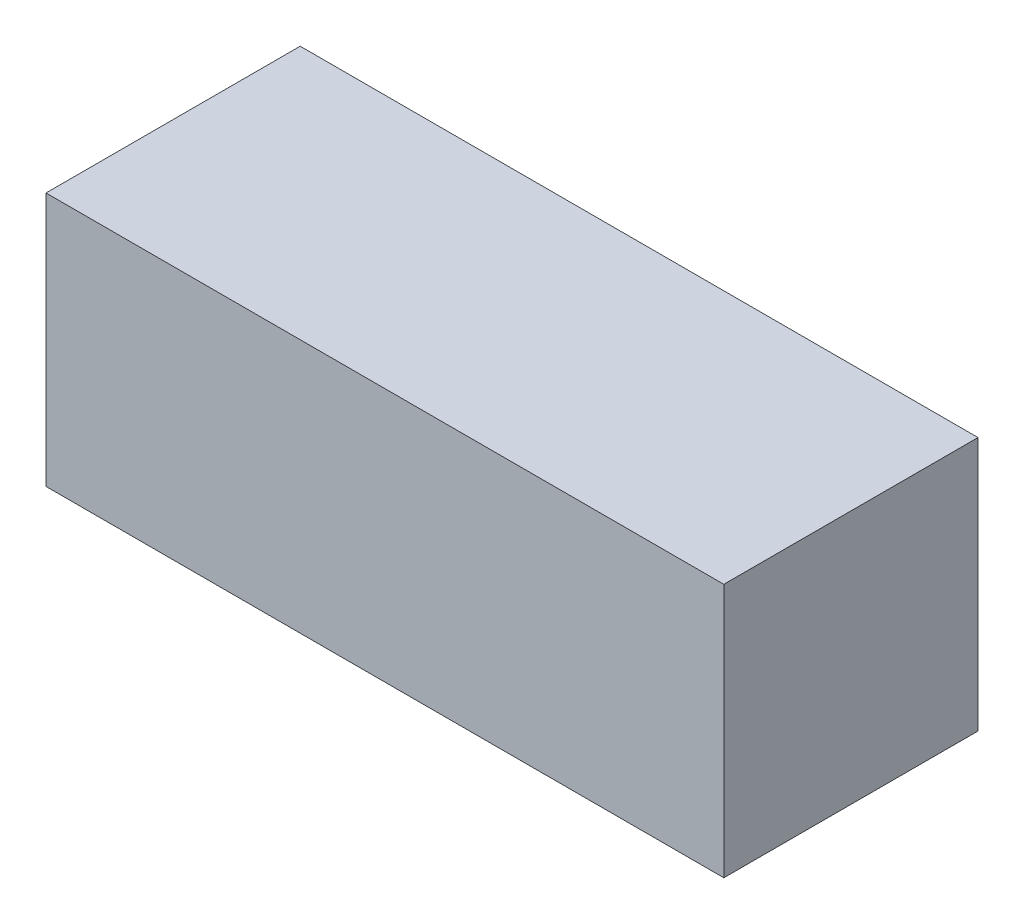
ISO-10303-21;
HEADER;
FILE_DESCRIPTION(('STEP AP214'),'2;1');
FILE_NAME('part.step','',(''),(''),'','','');
FILE_SCHEMA(('AUTOMOTIVE_DESIGN { 1 0 10303 214 1 1 1 1 }'));
ENDSEC;
DATA;
#1=APPLICATION_CONTEXT('core data for automotive mechanical design processes');
#2=APPLICATION_PROTOCOL_DEFINITION('international standard','automotive_design',2000,#1);
#3=PRODUCT_CONTEXT('',#1,'mechanical');
#4=PRODUCT('Part','Part','',(#3));
#5=PRODUCT_RELATED_PRODUCT_CATEGORY('part','',(#4));
#6=PRODUCT_DEFINITION_FORMATION('','',#4);
#7=PRODUCT_DEFINITION_CONTEXT('part definition',#1,'design');
#8=PRODUCT_DEFINITION('design','',#6,#7);
#9=PRODUCT_DEFINITION_SHAPE('','',#8);
#10=(LENGTH_UNIT() NAMED_UNIT(*) SI_UNIT(.MILLI.,.METRE.));
#11=(NAMED_UNIT(*) PLANE_ANGLE_UNIT() SI_UNIT($,.RADIAN.));
#12=(NAMED_UNIT(*) SI_UNIT($,.STERADIAN.) SOLID_ANGLE_UNIT());
#13=UNCERTAINTY_MEASURE_WITH_UNIT(LENGTH_MEASURE(1.E-05),#10,'distance_accuracy_value','');
#14=(GEOMETRIC_REPRESENTATION_CONTEXT(3) GLOBAL_UNCERTAINTY_ASSIGNED_CONTEXT((#13)) GLOBAL_UNIT_ASSIGNED_CONTEXT((#10,
#11,#12)) REPRESENTATION_CONTEXT('',''));
#15=CARTESIAN_POINT('',(0.,0.,0.));
#16=DIRECTION('',(0.,0.,1.));
#17=DIRECTION('',(1.,0.,0.));
#18=AXIS2_PLACEMENT_3D('',#15,#16,#17);
#19=CARTESIAN_POINT('',(-50.8,19.05,38.1));
#20=DIRECTION('',(1.,0.,0.));
#21=DIRECTION('',(0.,0.,-1.));
#22=AXIS2_PLACEMENT_3D('',#19,#20,#21);
#23=PLANE('',#22);
#24=DIRECTION('',(0.,-1.,0.));
#25=VECTOR('',#24,1.);
#26=CARTESIAN_POINT('',(-50.8,19.05,0.));
#27=LINE('',#26,#25);
#28=CARTESIAN_POINT('',(-50.8,19.05,0.));
#29=VERTEX_POINT('',#28);
#30=CARTESIAN_POINT('',(-50.8,-19.05,0.));
#31=VERTEX_POINT('',#30);
#32=EDGE_CURVE('E95',#29,#31,#27,.T.);
#33=ORIENTED_EDGE('',*,*,#32,.T.);
#34=DIRECTION('',(0.,0.,-1.));
#35=VECTOR('',#34,1.);
#36=CARTESIAN_POINT('',(-50.8,-19.05,38.1));
#37=LINE('',#36,#35);
#38=CARTESIAN_POINT('',(-50.8,-19.05,38.1));
#39=VERTEX_POINT('',#38);
#40=EDGE_CURVE('E11',#39,#31,#37,.T.);
#41=ORIENTED_EDGE('',*,*,#40,.F.);
#42=DIRECTION('',(0.,-1.,0.));
#43=VECTOR('',#42,1.);
#44=CARTESIAN_POINT('',(-50.8,19.05,38.1));
#45=LINE('',#44,#43);
#46=CARTESIAN_POINT('',(-50.8,19.05,38.1));
#47=VERTEX_POINT('',#46);
#48=EDGE_CURVE('E83',#47,#39,#45,.T.);
#49=ORIENTED_EDGE('',*,*,#48,.F.);
#50=DIRECTION('',(0.,0.,-1.));
#51=VECTOR('',#50,1.);
#52=CARTESIAN_POINT('',(-50.8,19.05,38.1));
#53=LINE('',#52,#51);
#54=EDGE_CURVE('E91',#47,#29,#53,.T.);
#55=ORIENTED_EDGE('',*,*,#54,.T.);
#56=EDGE_LOOP('',(#33,#41,#49,#55));
#57=FACE_BOUND('',#56,.T.);
#58=ADVANCED_FACE('F32',(#57),#23,.F.);
#59=CARTESIAN_POINT('',(-50.8,-19.05,38.1));
#60=DIRECTION('',(0.,1.,0.));
#61=DIRECTION('',(-1.,0.,0.));
#62=AXIS2_PLACEMENT_3D('',#59,#60,#61);
#63=PLANE('',#62);
#64=DIRECTION('',(1.,0.,0.));
#65=VECTOR('',#64,1.);
#66=CARTESIAN_POINT('',(-50.8,-19.05,0.));
#67=LINE('',#66,#65);
#68=CARTESIAN_POINT('',(50.8,-19.05,0.));
#69=VERTEX_POINT('',#68);
#70=EDGE_CURVE('E87',#31,#69,#67,.T.);
#71=ORIENTED_EDGE('',*,*,#70,.T.);
#72=DIRECTION('',(0.,0.,-1.));
#73=VECTOR('',#72,1.);
#74=CARTESIAN_POINT('',(50.8,-19.05,38.1));
#75=LINE('',#74,#73);
#76=CARTESIAN_POINT('',(50.8,-19.05,38.1));
#77=VERTEX_POINT('',#76);
#78=EDGE_CURVE('E40',#77,#69,#75,.T.);
#79=ORIENTED_EDGE('',*,*,#78,.F.);
#80=DIRECTION('',(1.,0.,0.));
#81=VECTOR('',#80,1.);
#82=CARTESIAN_POINT('',(-50.8,-19.05,38.1));
#83=LINE('',#82,#81);
#84=EDGE_CURVE('E78',#39,#77,#83,.T.);
#85=ORIENTED_EDGE('',*,*,#84,.F.);
#86=ORIENTED_EDGE('',*,*,#40,.T.);
#87=EDGE_LOOP('',(#71,#79,#85,#86));
#88=FACE_BOUND('',#87,.T.);
#89=ADVANCED_FACE('F86',(#88),#63,.F.);
#90=CARTESIAN_POINT('',(50.8,19.05,38.1));
#91=DIRECTION('',(-1.,0.,0.));
#92=DIRECTION('',(0.,0.,1.));
#93=AXIS2_PLACEMENT_3D('',#90,#91,#92);
#94=PLANE('',#93);
#95=DIRECTION('',(0.,1.,0.));
#96=VECTOR('',#95,1.);
#97=CARTESIAN_POINT('',(50.8,19.05,0.));
#98=LINE('',#97,#96);
#99=CARTESIAN_POINT('',(50.8,19.05,0.));
#100=VERTEX_POINT('',#99);
#101=EDGE_CURVE('E65',#69,#100,#98,.T.);
#102=ORIENTED_EDGE('',*,*,#101,.T.);
#103=DIRECTION('',(0.,0.,-1.));
#104=VECTOR('',#103,1.);
#105=CARTESIAN_POINT('',(50.8,19.05,38.1));
#106=LINE('',#105,#104);
#107=CARTESIAN_POINT('',(50.8,19.05,38.1));
#108=VERTEX_POINT('',#107);
#109=EDGE_CURVE('E88',#108,#100,#106,.T.);
#110=ORIENTED_EDGE('',*,*,#109,.F.);
#111=DIRECTION('',(0.,1.,0.));
#112=VECTOR('',#111,1.);
#113=CARTESIAN_POINT('',(50.8,19.05,38.1));
#114=LINE('',#113,#112);
#115=EDGE_CURVE('E81',#77,#108,#114,.T.);
#116=ORIENTED_EDGE('',*,*,#115,.F.);
#117=ORIENTED_EDGE('',*,*,#78,.T.);
#118=EDGE_LOOP('',(#102,#110,#116,#117));
#119=FACE_BOUND('',#118,.T.);
#120=ADVANCED_FACE('F89',(#119),#94,.F.);
#121=CARTESIAN_POINT('',(-50.8,19.05,38.1));
#122=DIRECTION('',(0.,-1.,0.));
#123=DIRECTION('',(1.,0.,0.));
#124=AXIS2_PLACEMENT_3D('',#121,#122,#123);
#125=PLANE('',#124);
#126=DIRECTION('',(-1.,0.,0.));
#127=VECTOR('',#126,1.);
#128=CARTESIAN_POINT('',(-50.8,19.05,0.));
#129=LINE('',#128,#127);
#130=EDGE_CURVE('E71',#100,#29,#129,.T.);
#131=ORIENTED_EDGE('',*,*,#130,.T.);
#132=ORIENTED_EDGE('',*,*,#54,.F.);
#133=DIRECTION('',(-1.,0.,0.));
#134=VECTOR('',#133,1.);
#135=CARTESIAN_POINT('',(-50.8,19.05,38.1));
#136=LINE('',#135,#134);
#137=EDGE_CURVE('E48',#108,#47,#136,.T.);
#138=ORIENTED_EDGE('',*,*,#137,.F.);
#139=ORIENTED_EDGE('',*,*,#109,.T.);
#140=EDGE_LOOP('',(#131,#132,#138,#139));
#141=FACE_BOUND('',#140,.T.);
#142=ADVANCED_FACE('F102',(#141),#125,.F.);
#143=CARTESIAN_POINT('',(0.,0.,38.1));
#144=DIRECTION('',(0.,0.,1.));
#145=DIRECTION('',(1.,0.,0.));
#146=AXIS2_PLACEMENT_3D('',#143,#144,#145);
#147=PLANE('',#146);
#148=ORIENTED_EDGE('',*,*,#48,.T.);
#149=ORIENTED_EDGE('',*,*,#84,.T.);
#150=ORIENTED_EDGE('',*,*,#115,.T.);
#151=ORIENTED_EDGE('',*,*,#137,.T.);
#152=EDGE_LOOP('',(#148,#149,#150,#151));
#153=FACE_BOUND('',#152,.T.);
#154=ADVANCED_FACE('F79',(#153),#147,.T.);
#155=CARTESIAN_POINT('',(0.,0.,0.));
#156=DIRECTION('',(0.,0.,1.));
#157=DIRECTION('',(1.,0.,0.));
#158=AXIS2_PLACEMENT_3D('',#155,#156,#157);
#159=PLANE('',#158);
#160=ORIENTED_EDGE('',*,*,#32,.F.);
#161=ORIENTED_EDGE('',*,*,#130,.F.);
#162=ORIENTED_EDGE('',*,*,#101,.F.);
#163=ORIENTED_EDGE('',*,*,#70,.F.);
#164=EDGE_LOOP('',(#160,#161,#162,#163));
#165=FACE_BOUND('',#164,.T.);
#166=ADVANCED_FACE('F105',(#165),#159,.F.);
#167=CLOSED_SHELL('',(#58,#89,#120,#142,#154,#166));
#168=MANIFOLD_SOLID_BREP('B2',#167);
#169=ADVANCED_BREP_SHAPE_REPRESENTATION('',(#18,#168),#14);
#170=SHAPE_DEFINITION_REPRESENTATION(#9,#169);
ENDSEC;
END-ISO-10303-21;
